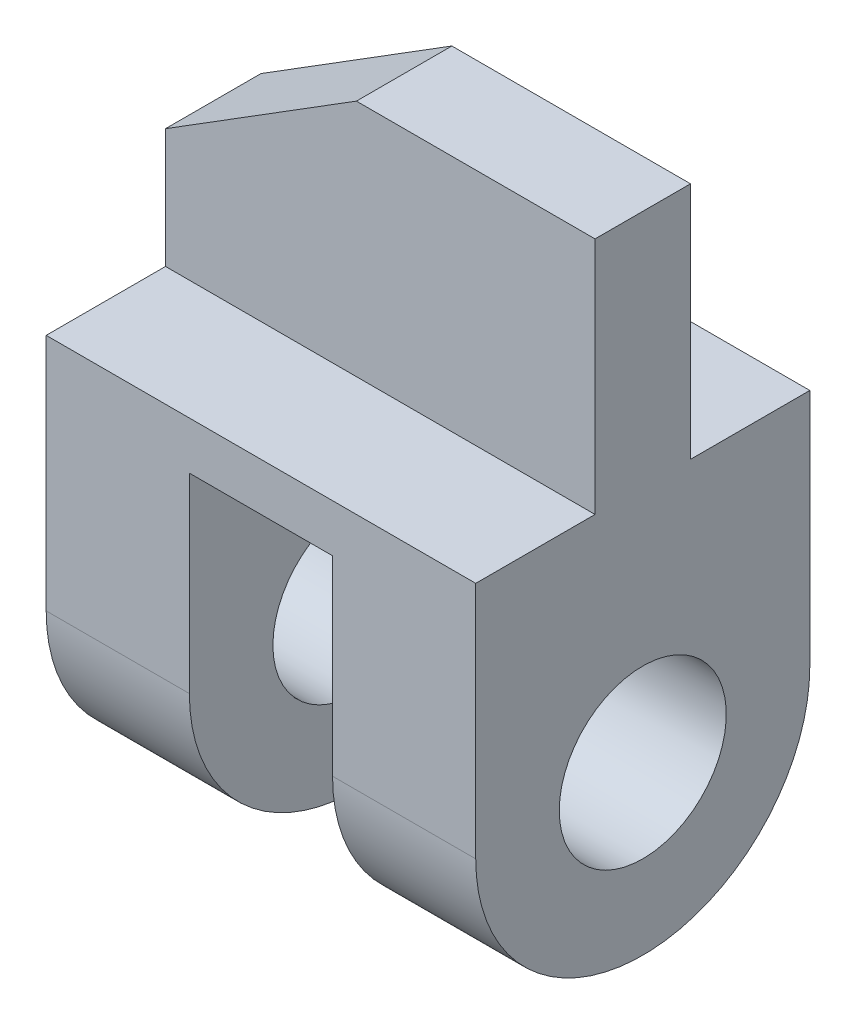
ISO-10303-21;
HEADER;
FILE_DESCRIPTION(('STEP AP214'),'2;1');
FILE_NAME('part.step','',(''),(''),'','','');
FILE_SCHEMA(('AUTOMOTIVE_DESIGN { 1 0 10303 214 1 1 1 1 }'));
ENDSEC;
DATA;
#1=APPLICATION_CONTEXT('core data for automotive mechanical design processes');
#2=APPLICATION_PROTOCOL_DEFINITION('international standard','automotive_design',2000,#1);
#3=PRODUCT_CONTEXT('',#1,'mechanical');
#4=PRODUCT('Part','Part','',(#3));
#5=PRODUCT_RELATED_PRODUCT_CATEGORY('part','',(#4));
#6=PRODUCT_DEFINITION_FORMATION('','',#4);
#7=PRODUCT_DEFINITION_CONTEXT('part definition',#1,'design');
#8=PRODUCT_DEFINITION('design','',#6,#7);
#9=PRODUCT_DEFINITION_SHAPE('','',#8);
#10=(LENGTH_UNIT() NAMED_UNIT(*) SI_UNIT(.MILLI.,.METRE.));
#11=(NAMED_UNIT(*) PLANE_ANGLE_UNIT() SI_UNIT($,.RADIAN.));
#12=(NAMED_UNIT(*) SI_UNIT($,.STERADIAN.) SOLID_ANGLE_UNIT());
#13=UNCERTAINTY_MEASURE_WITH_UNIT(LENGTH_MEASURE(1.E-05),#10,'distance_accuracy_value','');
#14=(GEOMETRIC_REPRESENTATION_CONTEXT(3) GLOBAL_UNCERTAINTY_ASSIGNED_CONTEXT((#13)) GLOBAL_UNIT_ASSIGNED_CONTEXT((#10,
#11,#12)) REPRESENTATION_CONTEXT('',''));
#15=CARTESIAN_POINT('',(0.,0.,0.));
#16=DIRECTION('',(0.,0.,1.));
#17=DIRECTION('',(1.,0.,0.));
#18=AXIS2_PLACEMENT_3D('',#15,#16,#17);
#19=CARTESIAN_POINT('',(-65.0371064269093,-61.5436164529544,70.));
#20=DIRECTION('',(1.,0.,0.));
#21=DIRECTION('',(0.,0.,-1.));
#22=AXIS2_PLACEMENT_3D('',#19,#20,#21);
#23=PLANE('',#22);
#24=CARTESIAN_POINT('',(-65.0371064269093,-26.5436164529544,35.));
#25=DIRECTION('',(-1.,0.,0.));
#26=DIRECTION('',(0.,0.,1.));
#27=AXIS2_PLACEMENT_3D('',#24,#25,#26);
#28=CIRCLE('',#27,17.5);
#29=CARTESIAN_POINT('',(-65.0371064269093,-26.5436164529544,52.5));
#30=VERTEX_POINT('',#29);
#31=EDGE_CURVE('E188',#30,#30,#28,.T.);
#32=ORIENTED_EDGE('',*,*,#31,.F.);
#33=EDGE_LOOP('',(#32));
#34=FACE_BOUND('',#33,.T.);
#35=CARTESIAN_POINT('',(-65.0371064269093,-26.5436164529544,35.));
#36=DIRECTION('',(-1.,0.,0.));
#37=DIRECTION('',(0.,0.,1.));
#38=AXIS2_PLACEMENT_3D('',#35,#36,#37);
#39=CIRCLE('',#38,35.);
#40=CARTESIAN_POINT('',(-65.0371064269093,-26.5436164529544,0.));
#41=VERTEX_POINT('',#40);
#42=CARTESIAN_POINT('',(-65.0371064269093,-26.5436164529544,70.));
#43=VERTEX_POINT('',#42);
#44=EDGE_CURVE('E47',#41,#43,#39,.T.);
#45=ORIENTED_EDGE('',*,*,#44,.T.);
#46=DIRECTION('',(0.,-1.,0.));
#47=VECTOR('',#46,1.);
#48=CARTESIAN_POINT('',(-65.0371064269093,-61.5436164529544,70.));
#49=LINE('',#48,#47);
#50=CARTESIAN_POINT('',(-65.0371064269093,23.4563835470456,70.));
#51=VERTEX_POINT('',#50);
#52=EDGE_CURVE('E128',#51,#43,#49,.T.);
#53=ORIENTED_EDGE('',*,*,#52,.F.);
#54=DIRECTION('',(0.,0.,1.));
#55=VECTOR('',#54,1.);
#56=CARTESIAN_POINT('',(-65.0371064269093,23.4563835470456,70.));
#57=LINE('',#56,#55);
#58=CARTESIAN_POINT('',(-65.0371064269093,23.4563835470456,45.));
#59=VERTEX_POINT('',#58);
#60=EDGE_CURVE('E243',#59,#51,#57,.T.);
#61=ORIENTED_EDGE('',*,*,#60,.F.);
#62=DIRECTION('',(0.,-1.,0.));
#63=VECTOR('',#62,1.);
#64=CARTESIAN_POINT('',(-65.0371064269093,-61.5436164529544,45.));
#65=LINE('',#64,#63);
#66=CARTESIAN_POINT('',(-65.0371064269093,48.4563835470456,45.));
#67=VERTEX_POINT('',#66);
#68=EDGE_CURVE('E246',#67,#59,#65,.T.);
#69=ORIENTED_EDGE('',*,*,#68,.F.);
#70=DIRECTION('',(0.,0.,-1.));
#71=VECTOR('',#70,1.);
#72=CARTESIAN_POINT('',(-65.0371064269093,48.4563835470456,70.));
#73=LINE('',#72,#71);
#74=CARTESIAN_POINT('',(-65.0371064269093,48.4563835470456,25.));
#75=VERTEX_POINT('',#74);
#76=EDGE_CURVE('E178',#67,#75,#73,.T.);
#77=ORIENTED_EDGE('',*,*,#76,.T.);
#78=DIRECTION('',(0.,-1.,0.));
#79=VECTOR('',#78,1.);
#80=CARTESIAN_POINT('',(-65.0371064269093,-61.5436164529544,25.));
#81=LINE('',#80,#79);
#82=CARTESIAN_POINT('',(-65.0371064269093,23.4563835470456,25.));
#83=VERTEX_POINT('',#82);
#84=EDGE_CURVE('E227',#75,#83,#81,.T.);
#85=ORIENTED_EDGE('',*,*,#84,.T.);
#86=DIRECTION('',(0.,0.,-1.));
#87=VECTOR('',#86,1.);
#88=CARTESIAN_POINT('',(-65.0371064269093,23.4563835470456,70.));
#89=LINE('',#88,#87);
#90=CARTESIAN_POINT('',(-65.0371064269093,23.4563835470456,0.));
#91=VERTEX_POINT('',#90);
#92=EDGE_CURVE('E224',#83,#91,#89,.T.);
#93=ORIENTED_EDGE('',*,*,#92,.T.);
#94=DIRECTION('',(0.,-1.,0.));
#95=VECTOR('',#94,1.);
#96=CARTESIAN_POINT('',(-65.0371064269093,-61.5436164529544,0.));
#97=LINE('',#96,#95);
#98=EDGE_CURVE('E131',#91,#41,#97,.T.);
#99=ORIENTED_EDGE('',*,*,#98,.T.);
#100=EDGE_LOOP('',(#45,#53,#61,#69,#77,#85,#93,#99));
#101=FACE_BOUND('',#100,.T.);
#102=ADVANCED_FACE('F32',(#34,#101),#23,.F.);
#103=CARTESIAN_POINT('',(24.9628935730907,73.4563835470456,70.));
#104=DIRECTION('',(-1.,0.,0.));
#105=DIRECTION('',(0.,0.,1.));
#106=AXIS2_PLACEMENT_3D('',#103,#104,#105);
#107=PLANE('',#106);
#108=CARTESIAN_POINT('',(24.9628935730907,-26.5436164529544,35.));
#109=DIRECTION('',(-1.,0.,0.));
#110=DIRECTION('',(0.,0.,1.));
#111=AXIS2_PLACEMENT_3D('',#108,#109,#110);
#112=CIRCLE('',#111,17.5);
#113=CARTESIAN_POINT('',(24.9628935730907,-26.5436164529544,52.5));
#114=VERTEX_POINT('',#113);
#115=EDGE_CURVE('E184',#114,#114,#112,.T.);
#116=ORIENTED_EDGE('',*,*,#115,.T.);
#117=EDGE_LOOP('',(#116));
#118=FACE_BOUND('',#117,.T.);
#119=DIRECTION('',(0.,1.,0.));
#120=VECTOR('',#119,1.);
#121=CARTESIAN_POINT('',(24.9628935730907,73.4563835470456,70.));
#122=LINE('',#121,#120);
#123=CARTESIAN_POINT('',(24.9628935730907,-26.5436164529544,70.));
#124=VERTEX_POINT('',#123);
#125=CARTESIAN_POINT('',(24.9628935730907,23.4563835470456,70.));
#126=VERTEX_POINT('',#125);
#127=EDGE_CURVE('E160',#124,#126,#122,.T.);
#128=ORIENTED_EDGE('',*,*,#127,.F.);
#129=CARTESIAN_POINT('',(24.9628935730907,-26.5436164529544,35.));
#130=DIRECTION('',(-1.,0.,0.));
#131=DIRECTION('',(0.,0.,1.));
#132=AXIS2_PLACEMENT_3D('',#129,#130,#131);
#133=CIRCLE('',#132,35.);
#134=CARTESIAN_POINT('',(24.9628935730907,-26.5436164529544,0.));
#135=VERTEX_POINT('',#134);
#136=EDGE_CURVE('E210',#135,#124,#133,.T.);
#137=ORIENTED_EDGE('',*,*,#136,.F.);
#138=DIRECTION('',(0.,1.,0.));
#139=VECTOR('',#138,1.);
#140=CARTESIAN_POINT('',(24.9628935730907,73.4563835470456,0.));
#141=LINE('',#140,#139);
#142=CARTESIAN_POINT('',(24.9628935730907,23.4563835470456,0.));
#143=VERTEX_POINT('',#142);
#144=EDGE_CURVE('E146',#135,#143,#141,.T.);
#145=ORIENTED_EDGE('',*,*,#144,.T.);
#146=DIRECTION('',(0.,0.,-1.));
#147=VECTOR('',#146,1.);
#148=CARTESIAN_POINT('',(24.9628935730907,23.4563835470456,0.));
#149=LINE('',#148,#147);
#150=CARTESIAN_POINT('',(24.9628935730907,23.4563835470456,25.));
#151=VERTEX_POINT('',#150);
#152=EDGE_CURVE('E218',#151,#143,#149,.T.);
#153=ORIENTED_EDGE('',*,*,#152,.F.);
#154=DIRECTION('',(0.,-1.,0.));
#155=VECTOR('',#154,1.);
#156=CARTESIAN_POINT('',(24.9628935730907,0.,25.));
#157=LINE('',#156,#155);
#158=CARTESIAN_POINT('',(24.9628935730907,73.4563835470456,25.));
#159=VERTEX_POINT('',#158);
#160=EDGE_CURVE('E212',#159,#151,#157,.T.);
#161=ORIENTED_EDGE('',*,*,#160,.F.);
#162=DIRECTION('',(0.,0.,-1.));
#163=VECTOR('',#162,1.);
#164=CARTESIAN_POINT('',(24.9628935730907,73.4563835470456,70.));
#165=LINE('',#164,#163);
#166=CARTESIAN_POINT('',(24.9628935730907,73.4563835470456,45.));
#167=VERTEX_POINT('',#166);
#168=EDGE_CURVE('E162',#167,#159,#165,.T.);
#169=ORIENTED_EDGE('',*,*,#168,.F.);
#170=DIRECTION('',(0.,-1.,0.));
#171=VECTOR('',#170,1.);
#172=CARTESIAN_POINT('',(24.9628935730907,0.,45.));
#173=LINE('',#172,#171);
#174=CARTESIAN_POINT('',(24.9628935730907,23.4563835470456,45.));
#175=VERTEX_POINT('',#174);
#176=EDGE_CURVE('E236',#167,#175,#173,.T.);
#177=ORIENTED_EDGE('',*,*,#176,.T.);
#178=DIRECTION('',(0.,0.,1.));
#179=VECTOR('',#178,1.);
#180=CARTESIAN_POINT('',(24.9628935730907,23.4563835470456,0.));
#181=LINE('',#180,#179);
#182=EDGE_CURVE('E233',#175,#126,#181,.T.);
#183=ORIENTED_EDGE('',*,*,#182,.T.);
#184=EDGE_LOOP('',(#128,#137,#145,#153,#161,#169,#177,#183));
#185=FACE_BOUND('',#184,.T.);
#186=ADVANCED_FACE('F275',(#118,#185),#107,.F.);
#187=CARTESIAN_POINT('',(-35.0371064269093,13.4563835470456,70.));
#188=DIRECTION('',(-1.,0.,0.));
#189=DIRECTION('',(0.,0.,1.));
#190=AXIS2_PLACEMENT_3D('',#187,#188,#189);
#191=PLANE('',#190);
#192=CARTESIAN_POINT('',(-35.0371064269093,-26.5436164529544,35.));
#193=DIRECTION('',(-1.,0.,0.));
#194=DIRECTION('',(0.,0.,1.));
#195=AXIS2_PLACEMENT_3D('',#192,#193,#194);
#196=CIRCLE('',#195,17.5);
#197=CARTESIAN_POINT('',(-35.0371064269093,-26.5436164529544,52.5));
#198=VERTEX_POINT('',#197);
#199=EDGE_CURVE('E153',#198,#198,#196,.T.);
#200=ORIENTED_EDGE('',*,*,#199,.T.);
#201=EDGE_LOOP('',(#200));
#202=FACE_BOUND('',#201,.T.);
#203=DIRECTION('',(0.,1.,0.));
#204=VECTOR('',#203,1.);
#205=CARTESIAN_POINT('',(-35.0371064269093,13.4563835470456,70.));
#206=LINE('',#205,#204);
#207=CARTESIAN_POINT('',(-35.0371064269093,-26.5436164529544,70.));
#208=VERTEX_POINT('',#207);
#209=CARTESIAN_POINT('',(-35.0371064269093,13.4563835470456,70.));
#210=VERTEX_POINT('',#209);
#211=EDGE_CURVE('E145',#208,#210,#206,.T.);
#212=ORIENTED_EDGE('',*,*,#211,.F.);
#213=CARTESIAN_POINT('',(-35.0371064269093,-26.5436164529544,35.));
#214=DIRECTION('',(-1.,0.,0.));
#215=DIRECTION('',(0.,0.,1.));
#216=AXIS2_PLACEMENT_3D('',#213,#214,#215);
#217=CIRCLE('',#216,35.);
#218=CARTESIAN_POINT('',(-35.0371064269093,-26.5436164529544,0.));
#219=VERTEX_POINT('',#218);
#220=EDGE_CURVE('E136',#219,#208,#217,.T.);
#221=ORIENTED_EDGE('',*,*,#220,.F.);
#222=DIRECTION('',(0.,1.,0.));
#223=VECTOR('',#222,1.);
#224=CARTESIAN_POINT('',(-35.0371064269093,13.4563835470456,0.));
#225=LINE('',#224,#223);
#226=CARTESIAN_POINT('',(-35.0371064269093,13.4563835470456,0.));
#227=VERTEX_POINT('',#226);
#228=EDGE_CURVE('E164',#219,#227,#225,.T.);
#229=ORIENTED_EDGE('',*,*,#228,.T.);
#230=DIRECTION('',(0.,0.,-1.));
#231=VECTOR('',#230,1.);
#232=CARTESIAN_POINT('',(-35.0371064269093,13.4563835470456,70.));
#233=LINE('',#232,#231);
#234=EDGE_CURVE('E175',#210,#227,#233,.T.);
#235=ORIENTED_EDGE('',*,*,#234,.F.);
#236=EDGE_LOOP('',(#212,#221,#229,#235));
#237=FACE_BOUND('',#236,.T.);
#238=ADVANCED_FACE('F209',(#202,#237),#191,.F.);
#239=CARTESIAN_POINT('',(-5.03710642690927,-61.5436164529544,70.));
#240=DIRECTION('',(1.,0.,0.));
#241=DIRECTION('',(0.,0.,-1.));
#242=AXIS2_PLACEMENT_3D('',#239,#240,#241);
#243=PLANE('',#242);
#244=CARTESIAN_POINT('',(-5.03710642690927,-26.5436164529544,35.));
#245=DIRECTION('',(1.,0.,0.));
#246=DIRECTION('',(0.,0.,-1.));
#247=AXIS2_PLACEMENT_3D('',#244,#245,#246);
#248=CIRCLE('',#247,17.5);
#249=CARTESIAN_POINT('',(-5.03710642690927,-26.5436164529544,17.5));
#250=VERTEX_POINT('',#249);
#251=EDGE_CURVE('E187',#250,#250,#248,.T.);
#252=ORIENTED_EDGE('',*,*,#251,.T.);
#253=EDGE_LOOP('',(#252));
#254=FACE_BOUND('',#253,.T.);
#255=CARTESIAN_POINT('',(-5.03710642690927,-26.5436164529544,35.));
#256=DIRECTION('',(1.,0.,0.));
#257=DIRECTION('',(0.,0.,-1.));
#258=AXIS2_PLACEMENT_3D('',#255,#256,#257);
#259=CIRCLE('',#258,35.);
#260=CARTESIAN_POINT('',(-5.03710642690927,-26.5436164529544,70.));
#261=VERTEX_POINT('',#260);
#262=CARTESIAN_POINT('',(-5.03710642690927,-26.5436164529544,0.));
#263=VERTEX_POINT('',#262);
#264=EDGE_CURVE('E54',#261,#263,#259,.T.);
#265=ORIENTED_EDGE('',*,*,#264,.F.);
#266=DIRECTION('',(0.,-1.,0.));
#267=VECTOR('',#266,1.);
#268=CARTESIAN_POINT('',(-5.03710642690927,-61.5436164529544,70.));
#269=LINE('',#268,#267);
#270=CARTESIAN_POINT('',(-5.03710642690927,13.4563835470456,70.));
#271=VERTEX_POINT('',#270);
#272=EDGE_CURVE('E157',#271,#261,#269,.T.);
#273=ORIENTED_EDGE('',*,*,#272,.F.);
#274=DIRECTION('',(0.,0.,-1.));
#275=VECTOR('',#274,1.);
#276=CARTESIAN_POINT('',(-5.03710642690927,13.4563835470456,70.));
#277=LINE('',#276,#275);
#278=CARTESIAN_POINT('',(-5.03710642690927,13.4563835470456,0.));
#279=VERTEX_POINT('',#278);
#280=EDGE_CURVE('E172',#271,#279,#277,.T.);
#281=ORIENTED_EDGE('',*,*,#280,.T.);
#282=DIRECTION('',(0.,-1.,0.));
#283=VECTOR('',#282,1.);
#284=CARTESIAN_POINT('',(-5.03710642690927,-61.5436164529544,0.));
#285=LINE('',#284,#283);
#286=EDGE_CURVE('E150',#279,#263,#285,.T.);
#287=ORIENTED_EDGE('',*,*,#286,.T.);
#288=EDGE_LOOP('',(#265,#273,#281,#287));
#289=FACE_BOUND('',#288,.T.);
#290=ADVANCED_FACE('F201',(#254,#289),#243,.F.);
#291=CARTESIAN_POINT('',(0.,0.,70.));
#292=DIRECTION('',(0.,0.,-1.));
#293=DIRECTION('',(-1.,0.,0.));
#294=AXIS2_PLACEMENT_3D('',#291,#292,#293);
#295=PLANE('',#294);
#296=DIRECTION('',(-1.,0.,0.));
#297=VECTOR('',#296,1.);
#298=CARTESIAN_POINT('',(71.9628935730908,-26.5436164529544,70.));
#299=LINE('',#298,#297);
#300=EDGE_CURVE('E11',#124,#261,#299,.T.);
#301=ORIENTED_EDGE('',*,*,#300,.F.);
#302=ORIENTED_EDGE('',*,*,#127,.T.);
#303=DIRECTION('',(1.,0.,0.));
#304=VECTOR('',#303,1.);
#305=CARTESIAN_POINT('',(0.,23.4563835470456,70.));
#306=LINE('',#305,#304);
#307=EDGE_CURVE('E144',#51,#126,#306,.T.);
#308=ORIENTED_EDGE('',*,*,#307,.F.);
#309=ORIENTED_EDGE('',*,*,#52,.T.);
#310=EDGE_CURVE('E36',#208,#43,#299,.T.);
#311=ORIENTED_EDGE('',*,*,#310,.F.);
#312=ORIENTED_EDGE('',*,*,#211,.T.);
#313=DIRECTION('',(1.,0.,0.));
#314=VECTOR('',#313,1.);
#315=CARTESIAN_POINT('',(-5.03710642690927,13.4563835470456,70.));
#316=LINE('',#315,#314);
#317=EDGE_CURVE('E148',#210,#271,#316,.T.);
#318=ORIENTED_EDGE('',*,*,#317,.T.);
#319=ORIENTED_EDGE('',*,*,#272,.T.);
#320=EDGE_LOOP('',(#301,#302,#308,#309,#311,#312,#318,#319));
#321=FACE_BOUND('',#320,.T.);
#322=ADVANCED_FACE('F142',(#321),#295,.F.);
#323=CARTESIAN_POINT('',(0.,0.,0.));
#324=DIRECTION('',(0.,0.,-1.));
#325=DIRECTION('',(-1.,0.,0.));
#326=AXIS2_PLACEMENT_3D('',#323,#324,#325);
#327=PLANE('',#326);
#328=ORIENTED_EDGE('',*,*,#144,.F.);
#329=DIRECTION('',(-1.,0.,0.));
#330=VECTOR('',#329,1.);
#331=CARTESIAN_POINT('',(71.9628935730908,-26.5436164529544,0.));
#332=LINE('',#331,#330);
#333=EDGE_CURVE('E139',#135,#263,#332,.T.);
#334=ORIENTED_EDGE('',*,*,#333,.T.);
#335=ORIENTED_EDGE('',*,*,#286,.F.);
#336=DIRECTION('',(1.,0.,0.));
#337=VECTOR('',#336,1.);
#338=CARTESIAN_POINT('',(-5.03710642690927,13.4563835470456,0.));
#339=LINE('',#338,#337);
#340=EDGE_CURVE('E166',#227,#279,#339,.T.);
#341=ORIENTED_EDGE('',*,*,#340,.F.);
#342=ORIENTED_EDGE('',*,*,#228,.F.);
#343=EDGE_CURVE('E191',#219,#41,#332,.T.);
#344=ORIENTED_EDGE('',*,*,#343,.T.);
#345=ORIENTED_EDGE('',*,*,#98,.F.);
#346=DIRECTION('',(-1.,0.,0.));
#347=VECTOR('',#346,1.);
#348=CARTESIAN_POINT('',(0.,23.4563835470456,0.));
#349=LINE('',#348,#347);
#350=EDGE_CURVE('E190',#143,#91,#349,.T.);
#351=ORIENTED_EDGE('',*,*,#350,.F.);
#352=EDGE_LOOP('',(#328,#334,#335,#341,#342,#344,#345,#351));
#353=FACE_BOUND('',#352,.T.);
#354=ADVANCED_FACE('F196',(#353),#327,.T.);
#355=CARTESIAN_POINT('',(24.9628935730907,73.4563835470456,70.));
#356=DIRECTION('',(0.,-1.,0.));
#357=DIRECTION('',(0.,0.,-1.));
#358=AXIS2_PLACEMENT_3D('',#355,#356,#357);
#359=PLANE('',#358);
#360=ORIENTED_EDGE('',*,*,#168,.T.);
#361=DIRECTION('',(1.,0.,0.));
#362=VECTOR('',#361,1.);
#363=CARTESIAN_POINT('',(-112.037106426909,73.4563835470456,25.));
#364=LINE('',#363,#362);
#365=CARTESIAN_POINT('',(-25.0371064269093,73.4563835470456,25.));
#366=VERTEX_POINT('',#365);
#367=EDGE_CURVE('E222',#366,#159,#364,.T.);
#368=ORIENTED_EDGE('',*,*,#367,.F.);
#369=DIRECTION('',(0.,0.,-1.));
#370=VECTOR('',#369,1.);
#371=CARTESIAN_POINT('',(-25.0371064269093,73.4563835470456,70.));
#372=LINE('',#371,#370);
#373=CARTESIAN_POINT('',(-25.0371064269093,73.4563835470456,45.));
#374=VERTEX_POINT('',#373);
#375=EDGE_CURVE('E181',#374,#366,#372,.T.);
#376=ORIENTED_EDGE('',*,*,#375,.F.);
#377=DIRECTION('',(1.,0.,0.));
#378=VECTOR('',#377,1.);
#379=CARTESIAN_POINT('',(-112.037106426909,73.4563835470456,45.));
#380=LINE('',#379,#378);
#381=EDGE_CURVE('E240',#374,#167,#380,.T.);
#382=ORIENTED_EDGE('',*,*,#381,.T.);
#383=EDGE_LOOP('',(#360,#368,#376,#382));
#384=FACE_BOUND('',#383,.T.);
#385=ADVANCED_FACE('F34',(#384),#359,.F.);
#386=CARTESIAN_POINT('',(-65.0371064269093,48.4563835470456,70.));
#387=DIRECTION('',(0.52999894000318,-0.847998304005088,0.));
#388=DIRECTION('',(0.847998304005088,0.52999894000318,0.));
#389=AXIS2_PLACEMENT_3D('',#386,#387,#388);
#390=PLANE('',#389);
#391=ORIENTED_EDGE('',*,*,#375,.T.);
#392=DIRECTION('',(-0.847998304005088,-0.52999894000318,0.));
#393=VECTOR('',#392,1.);
#394=CARTESIAN_POINT('',(-65.0371064269093,48.4563835470456,25.));
#395=LINE('',#394,#393);
#396=EDGE_CURVE('E230',#366,#75,#395,.T.);
#397=ORIENTED_EDGE('',*,*,#396,.T.);
#398=ORIENTED_EDGE('',*,*,#76,.F.);
#399=DIRECTION('',(-0.847998304005088,-0.52999894000318,0.));
#400=VECTOR('',#399,1.);
#401=CARTESIAN_POINT('',(-65.0371064269093,48.4563835470456,45.));
#402=LINE('',#401,#400);
#403=EDGE_CURVE('E248',#374,#67,#402,.T.);
#404=ORIENTED_EDGE('',*,*,#403,.F.);
#405=EDGE_LOOP('',(#391,#397,#398,#404));
#406=FACE_BOUND('',#405,.T.);
#407=ADVANCED_FACE('F286',(#406),#390,.F.);
#408=CARTESIAN_POINT('',(-5.03710642690927,13.4563835470456,70.));
#409=DIRECTION('',(0.,1.,0.));
#410=DIRECTION('',(0.,0.,1.));
#411=AXIS2_PLACEMENT_3D('',#408,#409,#410);
#412=PLANE('',#411);
#413=ORIENTED_EDGE('',*,*,#340,.T.);
#414=ORIENTED_EDGE('',*,*,#280,.F.);
#415=ORIENTED_EDGE('',*,*,#317,.F.);
#416=ORIENTED_EDGE('',*,*,#234,.T.);
#417=EDGE_LOOP('',(#413,#414,#415,#416));
#418=FACE_BOUND('',#417,.T.);
#419=ADVANCED_FACE('F206',(#418),#412,.F.);
#420=CARTESIAN_POINT('',(71.9628935730908,-26.5436164529544,35.));
#421=DIRECTION('',(-1.,0.,0.));
#422=DIRECTION('',(0.,0.,1.));
#423=AXIS2_PLACEMENT_3D('',#420,#421,#422);
#424=CYLINDRICAL_SURFACE('',#423,17.5);
#425=ORIENTED_EDGE('',*,*,#115,.F.);
#426=EDGE_LOOP('',(#425));
#427=FACE_BOUND('',#426,.T.);
#428=ORIENTED_EDGE('',*,*,#251,.F.);
#429=EDGE_LOOP('',(#428));
#430=FACE_BOUND('',#429,.T.);
#431=ADVANCED_FACE('F261',(#427,#430),#424,.F.);
#432=ORIENTED_EDGE('',*,*,#31,.T.);
#433=EDGE_LOOP('',(#432));
#434=FACE_BOUND('',#433,.T.);
#435=ORIENTED_EDGE('',*,*,#199,.F.);
#436=EDGE_LOOP('',(#435));
#437=FACE_BOUND('',#436,.T.);
#438=ADVANCED_FACE('F258',(#434,#437),#424,.F.);
#439=CARTESIAN_POINT('',(-112.037106426909,0.,45.));
#440=DIRECTION('',(0.,0.,1.));
#441=DIRECTION('',(1.,0.,0.));
#442=AXIS2_PLACEMENT_3D('',#439,#440,#441);
#443=PLANE('',#442);
#444=ORIENTED_EDGE('',*,*,#403,.T.);
#445=ORIENTED_EDGE('',*,*,#68,.T.);
#446=DIRECTION('',(1.,0.,0.));
#447=VECTOR('',#446,1.);
#448=CARTESIAN_POINT('',(-112.037106426909,23.4563835470456,45.));
#449=LINE('',#448,#447);
#450=EDGE_CURVE('E239',#59,#175,#449,.T.);
#451=ORIENTED_EDGE('',*,*,#450,.T.);
#452=ORIENTED_EDGE('',*,*,#176,.F.);
#453=ORIENTED_EDGE('',*,*,#381,.F.);
#454=EDGE_LOOP('',(#444,#445,#451,#452,#453));
#455=FACE_BOUND('',#454,.T.);
#456=ADVANCED_FACE('F260',(#455),#443,.T.);
#457=CARTESIAN_POINT('',(-112.037106426909,23.4563835470456,0.));
#458=DIRECTION('',(0.,1.,0.));
#459=DIRECTION('',(0.,0.,1.));
#460=AXIS2_PLACEMENT_3D('',#457,#458,#459);
#461=PLANE('',#460);
#462=ORIENTED_EDGE('',*,*,#60,.T.);
#463=ORIENTED_EDGE('',*,*,#307,.T.);
#464=ORIENTED_EDGE('',*,*,#182,.F.);
#465=ORIENTED_EDGE('',*,*,#450,.F.);
#466=EDGE_LOOP('',(#462,#463,#464,#465));
#467=FACE_BOUND('',#466,.T.);
#468=ADVANCED_FACE('F268',(#467),#461,.T.);
#469=CARTESIAN_POINT('',(-112.037106426909,0.,25.));
#470=DIRECTION('',(0.,0.,1.));
#471=DIRECTION('',(1.,0.,0.));
#472=AXIS2_PLACEMENT_3D('',#469,#470,#471);
#473=PLANE('',#472);
#474=ORIENTED_EDGE('',*,*,#367,.T.);
#475=ORIENTED_EDGE('',*,*,#160,.T.);
#476=DIRECTION('',(1.,0.,0.));
#477=VECTOR('',#476,1.);
#478=CARTESIAN_POINT('',(-112.037106426909,23.4563835470456,25.));
#479=LINE('',#478,#477);
#480=EDGE_CURVE('E221',#83,#151,#479,.T.);
#481=ORIENTED_EDGE('',*,*,#480,.F.);
#482=ORIENTED_EDGE('',*,*,#84,.F.);
#483=ORIENTED_EDGE('',*,*,#396,.F.);
#484=EDGE_LOOP('',(#474,#475,#481,#482,#483));
#485=FACE_BOUND('',#484,.T.);
#486=ADVANCED_FACE('F301',(#485),#473,.F.);
#487=CARTESIAN_POINT('',(-112.037106426909,23.4563835470456,0.));
#488=DIRECTION('',(0.,-1.,0.));
#489=DIRECTION('',(0.,0.,-1.));
#490=AXIS2_PLACEMENT_3D('',#487,#488,#489);
#491=PLANE('',#490);
#492=ORIENTED_EDGE('',*,*,#480,.T.);
#493=ORIENTED_EDGE('',*,*,#152,.T.);
#494=ORIENTED_EDGE('',*,*,#350,.T.);
#495=ORIENTED_EDGE('',*,*,#92,.F.);
#496=EDGE_LOOP('',(#492,#493,#494,#495));
#497=FACE_BOUND('',#496,.T.);
#498=ADVANCED_FACE('F307',(#497),#491,.F.);
#499=CARTESIAN_POINT('',(71.9628935730908,-26.5436164529544,35.));
#500=DIRECTION('',(-1.,0.,0.));
#501=DIRECTION('',(0.,0.,1.));
#502=AXIS2_PLACEMENT_3D('',#499,#500,#501);
#503=CYLINDRICAL_SURFACE('',#502,35.);
#504=ORIENTED_EDGE('',*,*,#220,.T.);
#505=ORIENTED_EDGE('',*,*,#310,.T.);
#506=ORIENTED_EDGE('',*,*,#44,.F.);
#507=ORIENTED_EDGE('',*,*,#343,.F.);
#508=EDGE_LOOP('',(#504,#505,#506,#507));
#509=FACE_BOUND('',#508,.T.);
#510=ADVANCED_FACE('F134',(#509),#503,.T.);
#511=ORIENTED_EDGE('',*,*,#136,.T.);
#512=ORIENTED_EDGE('',*,*,#300,.T.);
#513=ORIENTED_EDGE('',*,*,#264,.T.);
#514=ORIENTED_EDGE('',*,*,#333,.F.);
#515=EDGE_LOOP('',(#511,#512,#513,#514));
#516=FACE_BOUND('',#515,.T.);
#517=ADVANCED_FACE('F312',(#516),#503,.T.);
#518=CLOSED_SHELL('',(#102,#186,#238,#290,#322,#354,#385,#407,#419,#431,#438,#456,#468,#486,
#498,#510,#517));
#519=MANIFOLD_SOLID_BREP('B2',#518);
#520=ADVANCED_BREP_SHAPE_REPRESENTATION('',(#18,#519),#14);
#521=SHAPE_DEFINITION_REPRESENTATION(#9,#520);
ENDSEC;
END-ISO-10303-21;
